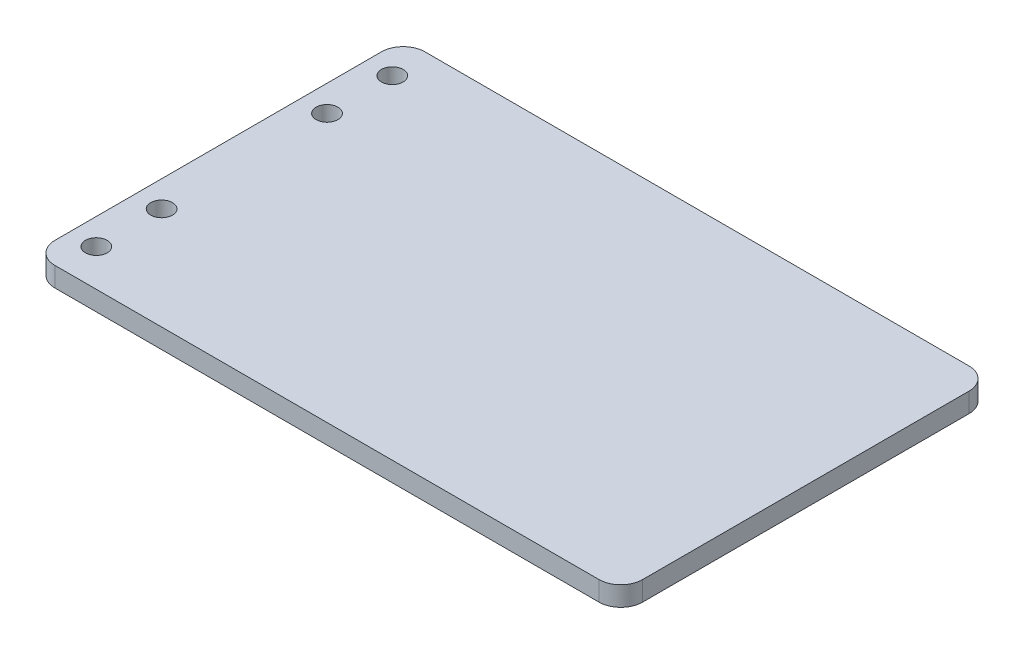
ISO-10303-21;
HEADER;
FILE_DESCRIPTION(('STEP AP214'),'2;1');
FILE_NAME('part.step','',(''),(''),'','','');
FILE_SCHEMA(('AUTOMOTIVE_DESIGN { 1 0 10303 214 1 1 1 1 }'));
ENDSEC;
DATA;
#1=APPLICATION_CONTEXT('core data for automotive mechanical design processes');
#2=APPLICATION_PROTOCOL_DEFINITION('international standard','automotive_design',2000,#1);
#3=PRODUCT_CONTEXT('',#1,'mechanical');
#4=PRODUCT('Part','Part','',(#3));
#5=PRODUCT_RELATED_PRODUCT_CATEGORY('part','',(#4));
#6=PRODUCT_DEFINITION_FORMATION('','',#4);
#7=PRODUCT_DEFINITION_CONTEXT('part definition',#1,'design');
#8=PRODUCT_DEFINITION('design','',#6,#7);
#9=PRODUCT_DEFINITION_SHAPE('','',#8);
#10=(LENGTH_UNIT() NAMED_UNIT(*) SI_UNIT(.MILLI.,.METRE.));
#11=(NAMED_UNIT(*) PLANE_ANGLE_UNIT() SI_UNIT($,.RADIAN.));
#12=(NAMED_UNIT(*) SI_UNIT($,.STERADIAN.) SOLID_ANGLE_UNIT());
#13=UNCERTAINTY_MEASURE_WITH_UNIT(LENGTH_MEASURE(1.E-05),#10,'distance_accuracy_value','');
#14=(GEOMETRIC_REPRESENTATION_CONTEXT(3) GLOBAL_UNCERTAINTY_ASSIGNED_CONTEXT((#13)) GLOBAL_UNIT_ASSIGNED_CONTEXT((#10,
#11,#12)) REPRESENTATION_CONTEXT('',''));
#15=CARTESIAN_POINT('',(0.,0.,0.));
#16=DIRECTION('',(0.,0.,1.));
#17=DIRECTION('',(1.,0.,0.));
#18=AXIS2_PLACEMENT_3D('',#15,#16,#17);
#19=CARTESIAN_POINT('',(12.5,0.45,7.5));
#20=DIRECTION('',(0.,-1.,0.));
#21=DIRECTION('',(0.,0.,-1.));
#22=AXIS2_PLACEMENT_3D('',#19,#20,#21);
#23=CYLINDRICAL_SURFACE('',#22,1.);
#24=CARTESIAN_POINT('',(12.5,-0.45,7.5));
#25=DIRECTION('',(0.,1.,0.));
#26=DIRECTION('',(0.,0.,-1.));
#27=AXIS2_PLACEMENT_3D('',#24,#25,#26);
#28=CIRCLE('',#27,1.);
#29=CARTESIAN_POINT('',(12.5,-0.45,8.5));
#30=VERTEX_POINT('',#29);
#31=CARTESIAN_POINT('',(13.5,-0.45,7.49999999999999));
#32=VERTEX_POINT('',#31);
#33=EDGE_CURVE('E146',#30,#32,#28,.T.);
#34=ORIENTED_EDGE('',*,*,#33,.T.);
#35=DIRECTION('',(0.,-1.,0.));
#36=VECTOR('',#35,1.);
#37=CARTESIAN_POINT('',(13.5,0.45,7.49999999999999));
#38=LINE('',#37,#36);
#39=CARTESIAN_POINT('',(13.5,0.45,7.49999999999999));
#40=VERTEX_POINT('',#39);
#41=EDGE_CURVE('E11',#40,#32,#38,.T.);
#42=ORIENTED_EDGE('',*,*,#41,.F.);
#43=CARTESIAN_POINT('',(12.5,0.45,7.5));
#44=DIRECTION('',(0.,1.,0.));
#45=DIRECTION('',(0.,0.,-1.));
#46=AXIS2_PLACEMENT_3D('',#43,#44,#45);
#47=CIRCLE('',#46,1.);
#48=CARTESIAN_POINT('',(12.5,0.45,8.5));
#49=VERTEX_POINT('',#48);
#50=EDGE_CURVE('E169',#49,#40,#47,.T.);
#51=ORIENTED_EDGE('',*,*,#50,.F.);
#52=DIRECTION('',(0.,-1.,0.));
#53=VECTOR('',#52,1.);
#54=CARTESIAN_POINT('',(12.5,0.45,8.5));
#55=LINE('',#54,#53);
#56=EDGE_CURVE('E142',#49,#30,#55,.T.);
#57=ORIENTED_EDGE('',*,*,#56,.T.);
#58=EDGE_LOOP('',(#34,#42,#51,#57));
#59=FACE_BOUND('',#58,.T.);
#60=ADVANCED_FACE('F45',(#59),#23,.T.);
#61=CARTESIAN_POINT('',(13.5,0.45,7.49999999999999));
#62=DIRECTION('',(-1.,0.,0.));
#63=DIRECTION('',(0.,0.,1.));
#64=AXIS2_PLACEMENT_3D('',#61,#62,#63);
#65=PLANE('',#64);
#66=DIRECTION('',(0.,0.,-1.));
#67=VECTOR('',#66,1.);
#68=CARTESIAN_POINT('',(13.5,-0.45,7.49999999999999));
#69=LINE('',#68,#67);
#70=CARTESIAN_POINT('',(13.5,-0.45,-7.5));
#71=VERTEX_POINT('',#70);
#72=EDGE_CURVE('E150',#32,#71,#69,.T.);
#73=ORIENTED_EDGE('',*,*,#72,.T.);
#74=DIRECTION('',(0.,-1.,0.));
#75=VECTOR('',#74,1.);
#76=CARTESIAN_POINT('',(13.5,0.45,-7.5));
#77=LINE('',#76,#75);
#78=CARTESIAN_POINT('',(13.5,0.45,-7.5));
#79=VERTEX_POINT('',#78);
#80=EDGE_CURVE('E54',#79,#71,#77,.T.);
#81=ORIENTED_EDGE('',*,*,#80,.F.);
#82=DIRECTION('',(0.,0.,-1.));
#83=VECTOR('',#82,1.);
#84=CARTESIAN_POINT('',(13.5,0.45,7.49999999999999));
#85=LINE('',#84,#83);
#86=EDGE_CURVE('E105',#40,#79,#85,.T.);
#87=ORIENTED_EDGE('',*,*,#86,.F.);
#88=ORIENTED_EDGE('',*,*,#41,.T.);
#89=EDGE_LOOP('',(#73,#81,#87,#88));
#90=FACE_BOUND('',#89,.T.);
#91=ADVANCED_FACE('F270',(#90),#65,.F.);
#92=CARTESIAN_POINT('',(12.5,0.45,-7.5));
#93=DIRECTION('',(0.,-1.,0.));
#94=DIRECTION('',(0.,0.,-1.));
#95=AXIS2_PLACEMENT_3D('',#92,#93,#94);
#96=CYLINDRICAL_SURFACE('',#95,1.);
#97=CARTESIAN_POINT('',(12.5,-0.45,-7.5));
#98=DIRECTION('',(0.,1.,0.));
#99=DIRECTION('',(0.,0.,1.));
#100=AXIS2_PLACEMENT_3D('',#97,#98,#99);
#101=CIRCLE('',#100,1.);
#102=CARTESIAN_POINT('',(12.5,-0.45,-8.5));
#103=VERTEX_POINT('',#102);
#104=EDGE_CURVE('E154',#71,#103,#101,.T.);
#105=ORIENTED_EDGE('',*,*,#104,.T.);
#106=DIRECTION('',(0.,-1.,0.));
#107=VECTOR('',#106,1.);
#108=CARTESIAN_POINT('',(12.5,0.45,-8.5));
#109=LINE('',#108,#107);
#110=CARTESIAN_POINT('',(12.5,0.45,-8.5));
#111=VERTEX_POINT('',#110);
#112=EDGE_CURVE('E180',#111,#103,#109,.T.);
#113=ORIENTED_EDGE('',*,*,#112,.F.);
#114=CARTESIAN_POINT('',(12.5,0.45,-7.5));
#115=DIRECTION('',(0.,1.,0.));
#116=DIRECTION('',(0.,0.,1.));
#117=AXIS2_PLACEMENT_3D('',#114,#115,#116);
#118=CIRCLE('',#117,1.);
#119=EDGE_CURVE('E190',#79,#111,#118,.T.);
#120=ORIENTED_EDGE('',*,*,#119,.F.);
#121=ORIENTED_EDGE('',*,*,#80,.T.);
#122=EDGE_LOOP('',(#105,#113,#120,#121));
#123=FACE_BOUND('',#122,.T.);
#124=ADVANCED_FACE('F188',(#123),#96,.T.);
#125=CARTESIAN_POINT('',(12.5,0.45,-8.5));
#126=DIRECTION('',(0.,0.,1.));
#127=DIRECTION('',(1.,0.,0.));
#128=AXIS2_PLACEMENT_3D('',#125,#126,#127);
#129=PLANE('',#128);
#130=DIRECTION('',(-1.,0.,0.));
#131=VECTOR('',#130,1.);
#132=CARTESIAN_POINT('',(12.5,-0.45,-8.5));
#133=LINE('',#132,#131);
#134=CARTESIAN_POINT('',(-12.5,-0.45,-8.5));
#135=VERTEX_POINT('',#134);
#136=EDGE_CURVE('E157',#103,#135,#133,.T.);
#137=ORIENTED_EDGE('',*,*,#136,.T.);
#138=DIRECTION('',(0.,-1.,0.));
#139=VECTOR('',#138,1.);
#140=CARTESIAN_POINT('',(-12.5,0.45,-8.5));
#141=LINE('',#140,#139);
#142=CARTESIAN_POINT('',(-12.5,0.45,-8.5));
#143=VERTEX_POINT('',#142);
#144=EDGE_CURVE('E176',#143,#135,#141,.T.);
#145=ORIENTED_EDGE('',*,*,#144,.F.);
#146=DIRECTION('',(-1.,0.,0.));
#147=VECTOR('',#146,1.);
#148=CARTESIAN_POINT('',(12.5,0.45,-8.5));
#149=LINE('',#148,#147);
#150=EDGE_CURVE('E203',#111,#143,#149,.T.);
#151=ORIENTED_EDGE('',*,*,#150,.F.);
#152=ORIENTED_EDGE('',*,*,#112,.T.);
#153=EDGE_LOOP('',(#137,#145,#151,#152));
#154=FACE_BOUND('',#153,.T.);
#155=ADVANCED_FACE('F198',(#154),#129,.F.);
#156=CARTESIAN_POINT('',(-12.5,0.45,-7.5));
#157=DIRECTION('',(0.,-1.,0.));
#158=DIRECTION('',(0.,0.,-1.));
#159=AXIS2_PLACEMENT_3D('',#156,#157,#158);
#160=CYLINDRICAL_SURFACE('',#159,1.);
#161=CARTESIAN_POINT('',(-12.5,-0.45,-7.5));
#162=DIRECTION('',(0.,1.,0.));
#163=DIRECTION('',(0.,0.,1.));
#164=AXIS2_PLACEMENT_3D('',#161,#162,#163);
#165=CIRCLE('',#164,1.);
#166=CARTESIAN_POINT('',(-13.5,-0.45,-7.49999999999999));
#167=VERTEX_POINT('',#166);
#168=EDGE_CURVE('E160',#135,#167,#165,.T.);
#169=ORIENTED_EDGE('',*,*,#168,.T.);
#170=DIRECTION('',(0.,-1.,0.));
#171=VECTOR('',#170,1.);
#172=CARTESIAN_POINT('',(-13.5,0.45,-7.49999999999999));
#173=LINE('',#172,#171);
#174=CARTESIAN_POINT('',(-13.5,0.45,-7.49999999999999));
#175=VERTEX_POINT('',#174);
#176=EDGE_CURVE('E135',#175,#167,#173,.T.);
#177=ORIENTED_EDGE('',*,*,#176,.F.);
#178=CARTESIAN_POINT('',(-12.5,0.45,-7.5));
#179=DIRECTION('',(0.,1.,0.));
#180=DIRECTION('',(0.,0.,1.));
#181=AXIS2_PLACEMENT_3D('',#178,#179,#180);
#182=CIRCLE('',#181,1.);
#183=EDGE_CURVE('E124',#143,#175,#182,.T.);
#184=ORIENTED_EDGE('',*,*,#183,.F.);
#185=ORIENTED_EDGE('',*,*,#144,.T.);
#186=EDGE_LOOP('',(#169,#177,#184,#185));
#187=FACE_BOUND('',#186,.T.);
#188=ADVANCED_FACE('F201',(#187),#160,.T.);
#189=CARTESIAN_POINT('',(-13.5,0.45,7.5));
#190=DIRECTION('',(1.,0.,0.));
#191=DIRECTION('',(0.,0.,-1.));
#192=AXIS2_PLACEMENT_3D('',#189,#190,#191);
#193=PLANE('',#192);
#194=DIRECTION('',(0.,0.,1.));
#195=VECTOR('',#194,1.);
#196=CARTESIAN_POINT('',(-13.5,-0.45,7.5));
#197=LINE('',#196,#195);
#198=CARTESIAN_POINT('',(-13.5,-0.45,7.5));
#199=VERTEX_POINT('',#198);
#200=EDGE_CURVE('E133',#167,#199,#197,.T.);
#201=ORIENTED_EDGE('',*,*,#200,.T.);
#202=DIRECTION('',(0.,-1.,0.));
#203=VECTOR('',#202,1.);
#204=CARTESIAN_POINT('',(-13.5,0.45,7.5));
#205=LINE('',#204,#203);
#206=CARTESIAN_POINT('',(-13.5,0.45,7.5));
#207=VERTEX_POINT('',#206);
#208=EDGE_CURVE('E130',#207,#199,#205,.T.);
#209=ORIENTED_EDGE('',*,*,#208,.F.);
#210=DIRECTION('',(0.,0.,1.));
#211=VECTOR('',#210,1.);
#212=CARTESIAN_POINT('',(-13.5,0.45,7.5));
#213=LINE('',#212,#211);
#214=EDGE_CURVE('E118',#175,#207,#213,.T.);
#215=ORIENTED_EDGE('',*,*,#214,.F.);
#216=ORIENTED_EDGE('',*,*,#176,.T.);
#217=EDGE_LOOP('',(#201,#209,#215,#216));
#218=FACE_BOUND('',#217,.T.);
#219=ADVANCED_FACE('F131',(#218),#193,.F.);
#220=CARTESIAN_POINT('',(-12.5,0.45,7.5));
#221=DIRECTION('',(0.,-1.,0.));
#222=DIRECTION('',(0.,0.,-1.));
#223=AXIS2_PLACEMENT_3D('',#220,#221,#222);
#224=CYLINDRICAL_SURFACE('',#223,1.);
#225=CARTESIAN_POINT('',(-12.5,-0.45,7.5));
#226=DIRECTION('',(0.,1.,0.));
#227=DIRECTION('',(0.,0.,-1.));
#228=AXIS2_PLACEMENT_3D('',#225,#226,#227);
#229=CIRCLE('',#228,1.);
#230=CARTESIAN_POINT('',(-12.5,-0.45,8.5));
#231=VERTEX_POINT('',#230);
#232=EDGE_CURVE('E91',#199,#231,#229,.T.);
#233=ORIENTED_EDGE('',*,*,#232,.T.);
#234=DIRECTION('',(0.,-1.,0.));
#235=VECTOR('',#234,1.);
#236=CARTESIAN_POINT('',(-12.5,0.45,8.5));
#237=LINE('',#236,#235);
#238=CARTESIAN_POINT('',(-12.5,0.45,8.5));
#239=VERTEX_POINT('',#238);
#240=EDGE_CURVE('E136',#239,#231,#237,.T.);
#241=ORIENTED_EDGE('',*,*,#240,.F.);
#242=CARTESIAN_POINT('',(-12.5,0.45,7.5));
#243=DIRECTION('',(0.,1.,0.));
#244=DIRECTION('',(0.,0.,-1.));
#245=AXIS2_PLACEMENT_3D('',#242,#243,#244);
#246=CIRCLE('',#245,1.);
#247=EDGE_CURVE('E122',#207,#239,#246,.T.);
#248=ORIENTED_EDGE('',*,*,#247,.F.);
#249=ORIENTED_EDGE('',*,*,#208,.T.);
#250=EDGE_LOOP('',(#233,#241,#248,#249));
#251=FACE_BOUND('',#250,.T.);
#252=ADVANCED_FACE('F138',(#251),#224,.T.);
#253=CARTESIAN_POINT('',(12.5,0.45,8.5));
#254=DIRECTION('',(0.,0.,-1.));
#255=DIRECTION('',(-1.,0.,0.));
#256=AXIS2_PLACEMENT_3D('',#253,#254,#255);
#257=PLANE('',#256);
#258=DIRECTION('',(1.,0.,0.));
#259=VECTOR('',#258,1.);
#260=CARTESIAN_POINT('',(12.5,-0.45,8.5));
#261=LINE('',#260,#259);
#262=EDGE_CURVE('E97',#231,#30,#261,.T.);
#263=ORIENTED_EDGE('',*,*,#262,.T.);
#264=ORIENTED_EDGE('',*,*,#56,.F.);
#265=DIRECTION('',(1.,0.,0.));
#266=VECTOR('',#265,1.);
#267=CARTESIAN_POINT('',(12.5,0.45,8.5));
#268=LINE('',#267,#266);
#269=EDGE_CURVE('E62',#239,#49,#268,.T.);
#270=ORIENTED_EDGE('',*,*,#269,.F.);
#271=ORIENTED_EDGE('',*,*,#240,.T.);
#272=EDGE_LOOP('',(#263,#264,#270,#271));
#273=FACE_BOUND('',#272,.T.);
#274=ADVANCED_FACE('F249',(#273),#257,.F.);
#275=CARTESIAN_POINT('',(12.5,0.45,7.5));
#276=DIRECTION('',(0.,-1.,0.));
#277=DIRECTION('',(0.,0.,-1.));
#278=AXIS2_PLACEMENT_3D('',#275,#276,#277);
#279=PLANE('',#278);
#280=CARTESIAN_POINT('',(-12.3,0.45,-6.8));
#281=DIRECTION('',(0.,1.,0.));
#282=DIRECTION('',(0.,0.,1.));
#283=AXIS2_PLACEMENT_3D('',#280,#281,#282);
#284=CIRCLE('',#283,0.500000000000001);
#285=CARTESIAN_POINT('',(-12.3,0.45,-6.3));
#286=VERTEX_POINT('',#285);
#287=EDGE_CURVE('E217',#286,#286,#284,.T.);
#288=ORIENTED_EDGE('',*,*,#287,.F.);
#289=EDGE_LOOP('',(#288));
#290=FACE_BOUND('',#289,.T.);
#291=CARTESIAN_POINT('',(-12.3,0.45,6.8));
#292=DIRECTION('',(0.,1.,0.));
#293=DIRECTION('',(0.,0.,-1.));
#294=AXIS2_PLACEMENT_3D('',#291,#292,#293);
#295=CIRCLE('',#294,0.500000000000001);
#296=CARTESIAN_POINT('',(-12.3,0.45,6.3));
#297=VERTEX_POINT('',#296);
#298=EDGE_CURVE('E225',#297,#297,#295,.T.);
#299=ORIENTED_EDGE('',*,*,#298,.F.);
#300=EDGE_LOOP('',(#299));
#301=FACE_BOUND('',#300,.T.);
#302=CARTESIAN_POINT('',(-12.3,0.45,3.8));
#303=DIRECTION('',(0.,1.,0.));
#304=DIRECTION('',(0.,0.,-1.));
#305=AXIS2_PLACEMENT_3D('',#302,#303,#304);
#306=CIRCLE('',#305,0.500000000000001);
#307=CARTESIAN_POINT('',(-12.3,0.45,3.3));
#308=VERTEX_POINT('',#307);
#309=EDGE_CURVE('E226',#308,#308,#306,.T.);
#310=ORIENTED_EDGE('',*,*,#309,.F.);
#311=EDGE_LOOP('',(#310));
#312=FACE_BOUND('',#311,.T.);
#313=CARTESIAN_POINT('',(-12.3,0.45,-3.8));
#314=DIRECTION('',(0.,1.,0.));
#315=DIRECTION('',(0.,0.,1.));
#316=AXIS2_PLACEMENT_3D('',#313,#314,#315);
#317=CIRCLE('',#316,0.500000000000001);
#318=CARTESIAN_POINT('',(-12.3,0.45,-3.3));
#319=VERTEX_POINT('',#318);
#320=EDGE_CURVE('E213',#319,#319,#317,.T.);
#321=ORIENTED_EDGE('',*,*,#320,.F.);
#322=EDGE_LOOP('',(#321));
#323=FACE_BOUND('',#322,.T.);
#324=ORIENTED_EDGE('',*,*,#50,.T.);
#325=ORIENTED_EDGE('',*,*,#86,.T.);
#326=ORIENTED_EDGE('',*,*,#119,.T.);
#327=ORIENTED_EDGE('',*,*,#150,.T.);
#328=ORIENTED_EDGE('',*,*,#183,.T.);
#329=ORIENTED_EDGE('',*,*,#214,.T.);
#330=ORIENTED_EDGE('',*,*,#247,.T.);
#331=ORIENTED_EDGE('',*,*,#269,.T.);
#332=EDGE_LOOP('',(#324,#325,#326,#327,#328,#329,#330,#331));
#333=FACE_BOUND('',#332,.T.);
#334=ADVANCED_FACE('F120',(#290,#301,#312,#323,#333),#279,.F.);
#335=CARTESIAN_POINT('',(12.5,-0.45,7.5));
#336=DIRECTION('',(0.,-1.,0.));
#337=DIRECTION('',(0.,0.,-1.));
#338=AXIS2_PLACEMENT_3D('',#335,#336,#337);
#339=PLANE('',#338);
#340=CARTESIAN_POINT('',(-12.3,-0.45,-6.8));
#341=DIRECTION('',(0.,1.,0.));
#342=DIRECTION('',(0.,0.,1.));
#343=AXIS2_PLACEMENT_3D('',#340,#341,#342);
#344=CIRCLE('',#343,0.500000000000001);
#345=CARTESIAN_POINT('',(-12.3,-0.45,-6.3));
#346=VERTEX_POINT('',#345);
#347=EDGE_CURVE('E230',#346,#346,#344,.T.);
#348=ORIENTED_EDGE('',*,*,#347,.T.);
#349=EDGE_LOOP('',(#348));
#350=FACE_BOUND('',#349,.T.);
#351=CARTESIAN_POINT('',(-12.3,-0.45,6.8));
#352=DIRECTION('',(0.,1.,0.));
#353=DIRECTION('',(0.,0.,-1.));
#354=AXIS2_PLACEMENT_3D('',#351,#352,#353);
#355=CIRCLE('',#354,0.500000000000001);
#356=CARTESIAN_POINT('',(-12.3,-0.45,6.3));
#357=VERTEX_POINT('',#356);
#358=EDGE_CURVE('E221',#357,#357,#355,.T.);
#359=ORIENTED_EDGE('',*,*,#358,.T.);
#360=EDGE_LOOP('',(#359));
#361=FACE_BOUND('',#360,.T.);
#362=CARTESIAN_POINT('',(-12.3,-0.45,3.8));
#363=DIRECTION('',(0.,1.,0.));
#364=DIRECTION('',(0.,0.,-1.));
#365=AXIS2_PLACEMENT_3D('',#362,#363,#364);
#366=CIRCLE('',#365,0.500000000000001);
#367=CARTESIAN_POINT('',(-12.3,-0.45,3.3));
#368=VERTEX_POINT('',#367);
#369=EDGE_CURVE('E237',#368,#368,#366,.T.);
#370=ORIENTED_EDGE('',*,*,#369,.T.);
#371=EDGE_LOOP('',(#370));
#372=FACE_BOUND('',#371,.T.);
#373=CARTESIAN_POINT('',(-12.3,-0.45,-3.8));
#374=DIRECTION('',(0.,1.,0.));
#375=DIRECTION('',(0.,0.,1.));
#376=AXIS2_PLACEMENT_3D('',#373,#374,#375);
#377=CIRCLE('',#376,0.500000000000001);
#378=CARTESIAN_POINT('',(-12.3,-0.45,-3.3));
#379=VERTEX_POINT('',#378);
#380=EDGE_CURVE('E151',#379,#379,#377,.T.);
#381=ORIENTED_EDGE('',*,*,#380,.T.);
#382=EDGE_LOOP('',(#381));
#383=FACE_BOUND('',#382,.T.);
#384=ORIENTED_EDGE('',*,*,#33,.F.);
#385=ORIENTED_EDGE('',*,*,#262,.F.);
#386=ORIENTED_EDGE('',*,*,#232,.F.);
#387=ORIENTED_EDGE('',*,*,#200,.F.);
#388=ORIENTED_EDGE('',*,*,#168,.F.);
#389=ORIENTED_EDGE('',*,*,#136,.F.);
#390=ORIENTED_EDGE('',*,*,#104,.F.);
#391=ORIENTED_EDGE('',*,*,#72,.F.);
#392=EDGE_LOOP('',(#384,#385,#386,#387,#388,#389,#390,#391));
#393=FACE_BOUND('',#392,.T.);
#394=ADVANCED_FACE('F194',(#350,#361,#372,#383,#393),#339,.T.);
#395=CARTESIAN_POINT('',(-12.3,-0.45,-3.8));
#396=DIRECTION('',(0.,1.,0.));
#397=DIRECTION('',(0.,0.,1.));
#398=AXIS2_PLACEMENT_3D('',#395,#396,#397);
#399=CYLINDRICAL_SURFACE('',#398,0.500000000000001);
#400=ORIENTED_EDGE('',*,*,#380,.F.);
#401=EDGE_LOOP('',(#400));
#402=FACE_BOUND('',#401,.T.);
#403=ORIENTED_EDGE('',*,*,#320,.T.);
#404=EDGE_LOOP('',(#403));
#405=FACE_BOUND('',#404,.T.);
#406=ADVANCED_FACE('F254',(#402,#405),#399,.F.);
#407=CARTESIAN_POINT('',(-12.3,-0.45,3.8));
#408=DIRECTION('',(0.,1.,0.));
#409=DIRECTION('',(0.,0.,1.));
#410=AXIS2_PLACEMENT_3D('',#407,#408,#409);
#411=CYLINDRICAL_SURFACE('',#410,0.500000000000001);
#412=ORIENTED_EDGE('',*,*,#369,.F.);
#413=EDGE_LOOP('',(#412));
#414=FACE_BOUND('',#413,.T.);
#415=ORIENTED_EDGE('',*,*,#309,.T.);
#416=EDGE_LOOP('',(#415));
#417=FACE_BOUND('',#416,.T.);
#418=ADVANCED_FACE('F245',(#414,#417),#411,.F.);
#419=CARTESIAN_POINT('',(-12.3,-0.45,6.8));
#420=DIRECTION('',(0.,1.,0.));
#421=DIRECTION('',(0.,0.,1.));
#422=AXIS2_PLACEMENT_3D('',#419,#420,#421);
#423=CYLINDRICAL_SURFACE('',#422,0.500000000000001);
#424=ORIENTED_EDGE('',*,*,#358,.F.);
#425=EDGE_LOOP('',(#424));
#426=FACE_BOUND('',#425,.T.);
#427=ORIENTED_EDGE('',*,*,#298,.T.);
#428=EDGE_LOOP('',(#427));
#429=FACE_BOUND('',#428,.T.);
#430=ADVANCED_FACE('F262',(#426,#429),#423,.F.);
#431=CARTESIAN_POINT('',(-12.3,-0.45,-6.8));
#432=DIRECTION('',(0.,1.,0.));
#433=DIRECTION('',(0.,0.,1.));
#434=AXIS2_PLACEMENT_3D('',#431,#432,#433);
#435=CYLINDRICAL_SURFACE('',#434,0.500000000000001);
#436=ORIENTED_EDGE('',*,*,#347,.F.);
#437=EDGE_LOOP('',(#436));
#438=FACE_BOUND('',#437,.T.);
#439=ORIENTED_EDGE('',*,*,#287,.T.);
#440=EDGE_LOOP('',(#439));
#441=FACE_BOUND('',#440,.T.);
#442=ADVANCED_FACE('F351',(#438,#441),#435,.F.);
#443=CLOSED_SHELL('',(#60,#91,#124,#155,#188,#219,#252,#274,#334,#394,#406,#418,#430,#442));
#444=MANIFOLD_SOLID_BREP('B2',#443);
#445=ADVANCED_BREP_SHAPE_REPRESENTATION('',(#18,#444),#14);
#446=SHAPE_DEFINITION_REPRESENTATION(#9,#445);
ENDSEC;
END-ISO-10303-21;
